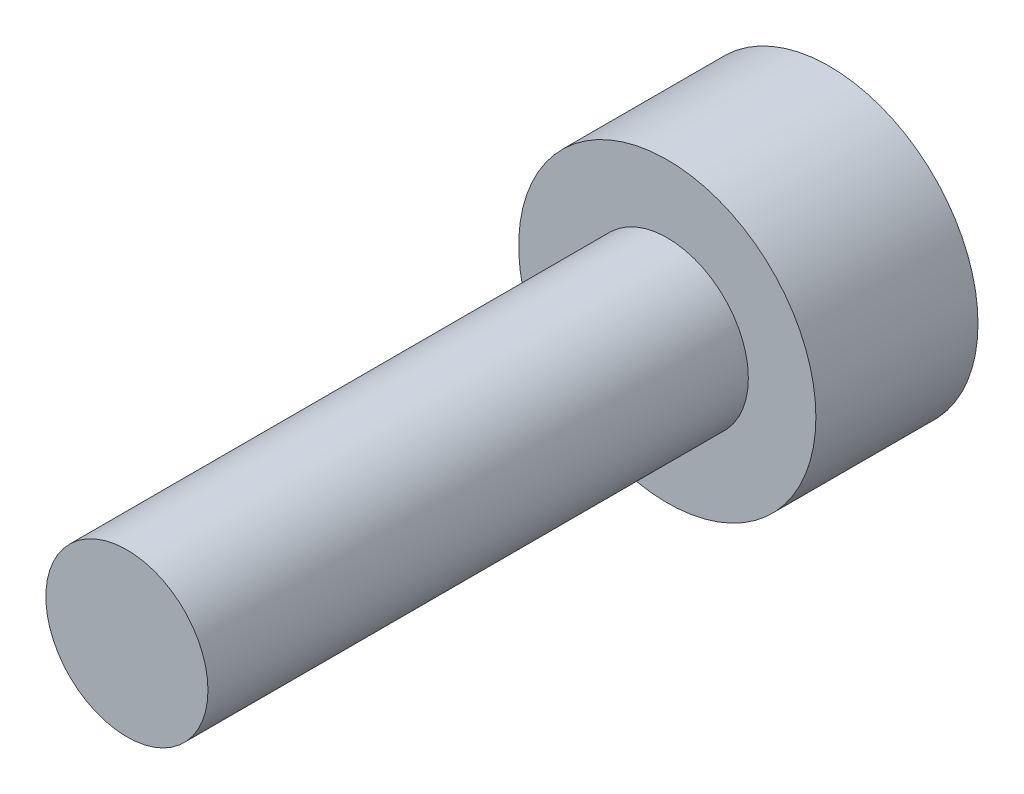
ISO-10303-21;
HEADER;
FILE_DESCRIPTION(('STEP AP214'),'2;1');
FILE_NAME('part.step','',(''),(''),'','','');
FILE_SCHEMA(('AUTOMOTIVE_DESIGN { 1 0 10303 214 1 1 1 1 }'));
ENDSEC;
DATA;
#1=APPLICATION_CONTEXT('core data for automotive mechanical design processes');
#2=APPLICATION_PROTOCOL_DEFINITION('international standard','automotive_design',2000,#1);
#3=PRODUCT_CONTEXT('',#1,'mechanical');
#4=PRODUCT('Part','Part','',(#3));
#5=PRODUCT_RELATED_PRODUCT_CATEGORY('part','',(#4));
#6=PRODUCT_DEFINITION_FORMATION('','',#4);
#7=PRODUCT_DEFINITION_CONTEXT('part definition',#1,'design');
#8=PRODUCT_DEFINITION('design','',#6,#7);
#9=PRODUCT_DEFINITION_SHAPE('','',#8);
#10=(LENGTH_UNIT() NAMED_UNIT(*) SI_UNIT(.MILLI.,.METRE.));
#11=(NAMED_UNIT(*) PLANE_ANGLE_UNIT() SI_UNIT($,.RADIAN.));
#12=(NAMED_UNIT(*) SI_UNIT($,.STERADIAN.) SOLID_ANGLE_UNIT());
#13=UNCERTAINTY_MEASURE_WITH_UNIT(LENGTH_MEASURE(1.E-05),#10,'distance_accuracy_value','');
#14=(GEOMETRIC_REPRESENTATION_CONTEXT(3) GLOBAL_UNCERTAINTY_ASSIGNED_CONTEXT((#13)) GLOBAL_UNIT_ASSIGNED_CONTEXT((#10,
#11,#12)) REPRESENTATION_CONTEXT('',''));
#15=CARTESIAN_POINT('',(0.,0.,0.));
#16=DIRECTION('',(0.,0.,1.));
#17=DIRECTION('',(1.,0.,0.));
#18=AXIS2_PLACEMENT_3D('',#15,#16,#17);
#19=CARTESIAN_POINT('',(0.,0.,-3.));
#20=DIRECTION('',(0.,0.,1.));
#21=DIRECTION('',(1.,0.,0.));
#22=AXIS2_PLACEMENT_3D('',#19,#20,#21);
#23=PLANE('',#22);
#24=CARTESIAN_POINT('',(0.,0.,-3.));
#25=DIRECTION('',(0.,0.,1.));
#26=DIRECTION('',(1.,0.,0.));
#27=AXIS2_PLACEMENT_3D('',#24,#25,#26);
#28=CIRCLE('',#27,2.75);
#29=CARTESIAN_POINT('',(2.75,0.,-3.));
#30=VERTEX_POINT('',#29);
#31=EDGE_CURVE('E47',#30,#30,#28,.T.);
#32=ORIENTED_EDGE('',*,*,#31,.F.);
#33=EDGE_LOOP('',(#32));
#34=FACE_BOUND('',#33,.T.);
#35=DIRECTION('',(0.5,0.866025403784439,0.));
#36=VECTOR('',#35,1.);
#37=CARTESIAN_POINT('',(0.721687836487032,-1.25,-3.));
#38=LINE('',#37,#36);
#39=CARTESIAN_POINT('',(0.721687836487032,-1.25,-3.));
#40=VERTEX_POINT('',#39);
#41=CARTESIAN_POINT('',(1.44337567297406,0.,-3.));
#42=VERTEX_POINT('',#41);
#43=EDGE_CURVE('E62',#40,#42,#38,.T.);
#44=ORIENTED_EDGE('',*,*,#43,.T.);
#45=DIRECTION('',(-0.5,0.866025403784439,0.));
#46=VECTOR('',#45,1.);
#47=CARTESIAN_POINT('',(1.44337567297406,0.,-3.));
#48=LINE('',#47,#46);
#49=CARTESIAN_POINT('',(0.721687836487032,1.25,-3.));
#50=VERTEX_POINT('',#49);
#51=EDGE_CURVE('E138',#42,#50,#48,.T.);
#52=ORIENTED_EDGE('',*,*,#51,.T.);
#53=DIRECTION('',(-1.,0.,0.));
#54=VECTOR('',#53,1.);
#55=CARTESIAN_POINT('',(0.721687836487032,1.25,-3.));
#56=LINE('',#55,#54);
#57=CARTESIAN_POINT('',(-0.721687836487032,1.25,-3.));
#58=VERTEX_POINT('',#57);
#59=EDGE_CURVE('E141',#50,#58,#56,.T.);
#60=ORIENTED_EDGE('',*,*,#59,.T.);
#61=DIRECTION('',(-0.5,-0.866025403784439,0.));
#62=VECTOR('',#61,1.);
#63=CARTESIAN_POINT('',(-0.721687836487032,1.25,-3.));
#64=LINE('',#63,#62);
#65=CARTESIAN_POINT('',(-1.44337567297406,0.,-3.));
#66=VERTEX_POINT('',#65);
#67=EDGE_CURVE('E150',#58,#66,#64,.T.);
#68=ORIENTED_EDGE('',*,*,#67,.T.);
#69=DIRECTION('',(0.5,-0.866025403784439,0.));
#70=VECTOR('',#69,1.);
#71=CARTESIAN_POINT('',(-1.44337567297406,0.,-3.));
#72=LINE('',#71,#70);
#73=CARTESIAN_POINT('',(-0.721687836487033,-1.25,-3.));
#74=VERTEX_POINT('',#73);
#75=EDGE_CURVE('E125',#66,#74,#72,.T.);
#76=ORIENTED_EDGE('',*,*,#75,.T.);
#77=DIRECTION('',(1.,0.,0.));
#78=VECTOR('',#77,1.);
#79=CARTESIAN_POINT('',(-0.721687836487033,-1.25,-3.));
#80=LINE('',#79,#78);
#81=EDGE_CURVE('E155',#74,#40,#80,.T.);
#82=ORIENTED_EDGE('',*,*,#81,.T.);
#83=EDGE_LOOP('',(#44,#52,#60,#68,#76,#82));
#84=FACE_BOUND('',#83,.T.);
#85=ADVANCED_FACE('F44',(#34,#84),#23,.F.);
#86=CARTESIAN_POINT('',(0.,0.,0.));
#87=DIRECTION('',(0.,0.,-1.));
#88=DIRECTION('',(-1.,0.,0.));
#89=AXIS2_PLACEMENT_3D('',#86,#87,#88);
#90=CYLINDRICAL_SURFACE('',#89,2.75);
#91=CARTESIAN_POINT('',(0.,0.,0.));
#92=DIRECTION('',(0.,0.,1.));
#93=DIRECTION('',(1.,0.,0.));
#94=AXIS2_PLACEMENT_3D('',#91,#92,#93);
#95=CIRCLE('',#94,2.75);
#96=CARTESIAN_POINT('',(2.75,0.,0.));
#97=VERTEX_POINT('',#96);
#98=EDGE_CURVE('E54',#97,#97,#95,.T.);
#99=ORIENTED_EDGE('',*,*,#98,.F.);
#100=EDGE_LOOP('',(#99));
#101=FACE_BOUND('',#100,.T.);
#102=ORIENTED_EDGE('',*,*,#31,.T.);
#103=EDGE_LOOP('',(#102));
#104=FACE_BOUND('',#103,.T.);
#105=ADVANCED_FACE('F50',(#101,#104),#90,.T.);
#106=CARTESIAN_POINT('',(0.,0.,0.));
#107=DIRECTION('',(0.,0.,1.));
#108=DIRECTION('',(1.,0.,0.));
#109=AXIS2_PLACEMENT_3D('',#106,#107,#108);
#110=PLANE('',#109);
#111=CARTESIAN_POINT('',(0.,0.,0.));
#112=DIRECTION('',(0.,0.,1.));
#113=DIRECTION('',(1.,0.,0.));
#114=AXIS2_PLACEMENT_3D('',#111,#112,#113);
#115=CIRCLE('',#114,1.5);
#116=CARTESIAN_POINT('',(1.5,0.,0.));
#117=VERTEX_POINT('',#116);
#118=EDGE_CURVE('E11',#117,#117,#115,.T.);
#119=ORIENTED_EDGE('',*,*,#118,.F.);
#120=EDGE_LOOP('',(#119));
#121=FACE_BOUND('',#120,.T.);
#122=ORIENTED_EDGE('',*,*,#98,.T.);
#123=EDGE_LOOP('',(#122));
#124=FACE_BOUND('',#123,.T.);
#125=ADVANCED_FACE('F212',(#121,#124),#110,.T.);
#126=CARTESIAN_POINT('',(0.,0.,10.));
#127=DIRECTION('',(0.,0.,-1.));
#128=DIRECTION('',(-1.,0.,0.));
#129=AXIS2_PLACEMENT_3D('',#126,#127,#128);
#130=CYLINDRICAL_SURFACE('',#129,1.5);
#131=CARTESIAN_POINT('',(0.,0.,10.));
#132=DIRECTION('',(0.,0.,1.));
#133=DIRECTION('',(1.,0.,0.));
#134=AXIS2_PLACEMENT_3D('',#131,#132,#133);
#135=CIRCLE('',#134,1.5);
#136=CARTESIAN_POINT('',(1.5,0.,10.));
#137=VERTEX_POINT('',#136);
#138=EDGE_CURVE('E166',#137,#137,#135,.T.);
#139=ORIENTED_EDGE('',*,*,#138,.F.);
#140=EDGE_LOOP('',(#139));
#141=FACE_BOUND('',#140,.T.);
#142=ORIENTED_EDGE('',*,*,#118,.T.);
#143=EDGE_LOOP('',(#142));
#144=FACE_BOUND('',#143,.T.);
#145=ADVANCED_FACE('F209',(#141,#144),#130,.T.);
#146=CARTESIAN_POINT('',(0.,0.,10.));
#147=DIRECTION('',(0.,0.,1.));
#148=DIRECTION('',(1.,0.,0.));
#149=AXIS2_PLACEMENT_3D('',#146,#147,#148);
#150=PLANE('',#149);
#151=ORIENTED_EDGE('',*,*,#138,.T.);
#152=EDGE_LOOP('',(#151));
#153=FACE_BOUND('',#152,.T.);
#154=ADVANCED_FACE('F204',(#153),#150,.T.);
#155=CARTESIAN_POINT('',(0.721687836487032,-1.25,-1.7));
#156=DIRECTION('',(-0.866025403784439,0.5,0.));
#157=DIRECTION('',(-0.5,-0.866025403784439,0.));
#158=AXIS2_PLACEMENT_3D('',#155,#156,#157);
#159=PLANE('',#158);
#160=ORIENTED_EDGE('',*,*,#43,.F.);
#161=DIRECTION('',(0.,0.,-1.));
#162=VECTOR('',#161,1.);
#163=CARTESIAN_POINT('',(0.721687836487032,-1.25,-1.7));
#164=LINE('',#163,#162);
#165=CARTESIAN_POINT('',(0.721687836487032,-1.25,-1.7));
#166=VERTEX_POINT('',#165);
#167=EDGE_CURVE('E132',#166,#40,#164,.T.);
#168=ORIENTED_EDGE('',*,*,#167,.F.);
#169=DIRECTION('',(0.5,0.866025403784439,0.));
#170=VECTOR('',#169,1.);
#171=CARTESIAN_POINT('',(0.721687836487032,-1.25,-1.7));
#172=LINE('',#171,#170);
#173=CARTESIAN_POINT('',(1.44337567297406,0.,-1.7));
#174=VERTEX_POINT('',#173);
#175=EDGE_CURVE('E156',#166,#174,#172,.T.);
#176=ORIENTED_EDGE('',*,*,#175,.T.);
#177=DIRECTION('',(0.,0.,-1.));
#178=VECTOR('',#177,1.);
#179=CARTESIAN_POINT('',(1.44337567297406,0.,-1.7));
#180=LINE('',#179,#178);
#181=EDGE_CURVE('E167',#174,#42,#180,.T.);
#182=ORIENTED_EDGE('',*,*,#181,.T.);
#183=EDGE_LOOP('',(#160,#168,#176,#182));
#184=FACE_BOUND('',#183,.T.);
#185=ADVANCED_FACE('F184',(#184),#159,.T.);
#186=CARTESIAN_POINT('',(1.44337567297406,0.,-1.7));
#187=DIRECTION('',(-0.866025403784439,-0.5,0.));
#188=DIRECTION('',(0.5,-0.866025403784439,0.));
#189=AXIS2_PLACEMENT_3D('',#186,#187,#188);
#190=PLANE('',#189);
#191=ORIENTED_EDGE('',*,*,#51,.F.);
#192=ORIENTED_EDGE('',*,*,#181,.F.);
#193=DIRECTION('',(-0.5,0.866025403784439,0.));
#194=VECTOR('',#193,1.);
#195=CARTESIAN_POINT('',(1.44337567297406,0.,-1.7));
#196=LINE('',#195,#194);
#197=CARTESIAN_POINT('',(0.721687836487032,1.25,-1.7));
#198=VERTEX_POINT('',#197);
#199=EDGE_CURVE('E105',#174,#198,#196,.T.);
#200=ORIENTED_EDGE('',*,*,#199,.T.);
#201=DIRECTION('',(0.,0.,-1.));
#202=VECTOR('',#201,1.);
#203=CARTESIAN_POINT('',(0.721687836487032,1.25,-1.7));
#204=LINE('',#203,#202);
#205=EDGE_CURVE('E162',#198,#50,#204,.T.);
#206=ORIENTED_EDGE('',*,*,#205,.T.);
#207=EDGE_LOOP('',(#191,#192,#200,#206));
#208=FACE_BOUND('',#207,.T.);
#209=ADVANCED_FACE('F198',(#208),#190,.T.);
#210=CARTESIAN_POINT('',(0.721687836487032,1.25,-1.7));
#211=DIRECTION('',(0.,-1.,0.));
#212=DIRECTION('',(1.,0.,0.));
#213=AXIS2_PLACEMENT_3D('',#210,#211,#212);
#214=PLANE('',#213);
#215=ORIENTED_EDGE('',*,*,#59,.F.);
#216=ORIENTED_EDGE('',*,*,#205,.F.);
#217=DIRECTION('',(-1.,0.,0.));
#218=VECTOR('',#217,1.);
#219=CARTESIAN_POINT('',(0.721687836487032,1.25,-1.7));
#220=LINE('',#219,#218);
#221=CARTESIAN_POINT('',(-0.721687836487032,1.25,-1.7));
#222=VERTEX_POINT('',#221);
#223=EDGE_CURVE('E121',#198,#222,#220,.T.);
#224=ORIENTED_EDGE('',*,*,#223,.T.);
#225=DIRECTION('',(0.,0.,-1.));
#226=VECTOR('',#225,1.);
#227=CARTESIAN_POINT('',(-0.721687836487032,1.25,-1.7));
#228=LINE('',#227,#226);
#229=EDGE_CURVE('E119',#222,#58,#228,.T.);
#230=ORIENTED_EDGE('',*,*,#229,.T.);
#231=EDGE_LOOP('',(#215,#216,#224,#230));
#232=FACE_BOUND('',#231,.T.);
#233=ADVANCED_FACE('F193',(#232),#214,.T.);
#234=CARTESIAN_POINT('',(-0.721687836487032,1.25,-1.7));
#235=DIRECTION('',(0.866025403784439,-0.5,0.));
#236=DIRECTION('',(0.5,0.866025403784439,0.));
#237=AXIS2_PLACEMENT_3D('',#234,#235,#236);
#238=PLANE('',#237);
#239=ORIENTED_EDGE('',*,*,#67,.F.);
#240=ORIENTED_EDGE('',*,*,#229,.F.);
#241=DIRECTION('',(-0.5,-0.866025403784439,0.));
#242=VECTOR('',#241,1.);
#243=CARTESIAN_POINT('',(-0.721687836487032,1.25,-1.7));
#244=LINE('',#243,#242);
#245=CARTESIAN_POINT('',(-1.44337567297406,0.,-1.7));
#246=VERTEX_POINT('',#245);
#247=EDGE_CURVE('E115',#222,#246,#244,.T.);
#248=ORIENTED_EDGE('',*,*,#247,.T.);
#249=DIRECTION('',(0.,0.,-1.));
#250=VECTOR('',#249,1.);
#251=CARTESIAN_POINT('',(-1.44337567297406,0.,-1.7));
#252=LINE('',#251,#250);
#253=EDGE_CURVE('E118',#246,#66,#252,.T.);
#254=ORIENTED_EDGE('',*,*,#253,.T.);
#255=EDGE_LOOP('',(#239,#240,#248,#254));
#256=FACE_BOUND('',#255,.T.);
#257=ADVANCED_FACE('F113',(#256),#238,.T.);
#258=CARTESIAN_POINT('',(-1.44337567297406,0.,-1.7));
#259=DIRECTION('',(0.866025403784439,0.5,0.));
#260=DIRECTION('',(-0.5,0.866025403784439,0.));
#261=AXIS2_PLACEMENT_3D('',#258,#259,#260);
#262=PLANE('',#261);
#263=ORIENTED_EDGE('',*,*,#75,.F.);
#264=ORIENTED_EDGE('',*,*,#253,.F.);
#265=DIRECTION('',(0.5,-0.866025403784439,0.));
#266=VECTOR('',#265,1.);
#267=CARTESIAN_POINT('',(-1.44337567297406,0.,-1.7));
#268=LINE('',#267,#266);
#269=CARTESIAN_POINT('',(-0.721687836487033,-1.25,-1.7));
#270=VERTEX_POINT('',#269);
#271=EDGE_CURVE('E116',#246,#270,#268,.T.);
#272=ORIENTED_EDGE('',*,*,#271,.T.);
#273=DIRECTION('',(0.,0.,-1.));
#274=VECTOR('',#273,1.);
#275=CARTESIAN_POINT('',(-0.721687836487033,-1.25,-1.7));
#276=LINE('',#275,#274);
#277=EDGE_CURVE('E91',#270,#74,#276,.T.);
#278=ORIENTED_EDGE('',*,*,#277,.T.);
#279=EDGE_LOOP('',(#263,#264,#272,#278));
#280=FACE_BOUND('',#279,.T.);
#281=ADVANCED_FACE('F124',(#280),#262,.T.);
#282=CARTESIAN_POINT('',(-0.721687836487033,-1.25,-1.7));
#283=DIRECTION('',(0.,1.,0.));
#284=DIRECTION('',(-1.,0.,0.));
#285=AXIS2_PLACEMENT_3D('',#282,#283,#284);
#286=PLANE('',#285);
#287=ORIENTED_EDGE('',*,*,#81,.F.);
#288=ORIENTED_EDGE('',*,*,#277,.F.);
#289=DIRECTION('',(1.,0.,0.));
#290=VECTOR('',#289,1.);
#291=CARTESIAN_POINT('',(-0.721687836487033,-1.25,-1.7));
#292=LINE('',#291,#290);
#293=EDGE_CURVE('E72',#270,#166,#292,.T.);
#294=ORIENTED_EDGE('',*,*,#293,.T.);
#295=ORIENTED_EDGE('',*,*,#167,.T.);
#296=EDGE_LOOP('',(#287,#288,#294,#295));
#297=FACE_BOUND('',#296,.T.);
#298=ADVANCED_FACE('F181',(#297),#286,.T.);
#299=CARTESIAN_POINT('',(0.,0.,-1.7));
#300=DIRECTION('',(0.,0.,1.));
#301=DIRECTION('',(1.,0.,0.));
#302=AXIS2_PLACEMENT_3D('',#299,#300,#301);
#303=PLANE('',#302);
#304=ORIENTED_EDGE('',*,*,#175,.F.);
#305=ORIENTED_EDGE('',*,*,#293,.F.);
#306=ORIENTED_EDGE('',*,*,#271,.F.);
#307=ORIENTED_EDGE('',*,*,#247,.F.);
#308=ORIENTED_EDGE('',*,*,#223,.F.);
#309=ORIENTED_EDGE('',*,*,#199,.F.);
#310=EDGE_LOOP('',(#304,#305,#306,#307,#308,#309));
#311=FACE_BOUND('',#310,.T.);
#312=ADVANCED_FACE('F129',(#311),#303,.F.);
#313=CLOSED_SHELL('',(#85,#105,#125,#145,#154,#185,#209,#233,#257,#281,#298,#312));
#314=MANIFOLD_SOLID_BREP('B2',#313);
#315=ADVANCED_BREP_SHAPE_REPRESENTATION('',(#18,#314),#14);
#316=SHAPE_DEFINITION_REPRESENTATION(#9,#315);
ENDSEC;
END-ISO-10303-21;
